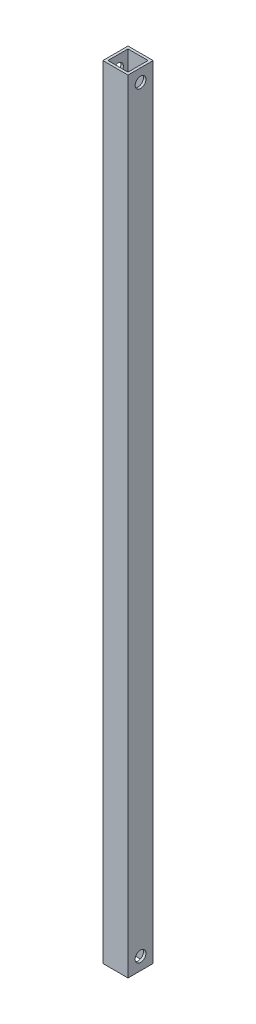
ISO-10303-21;
HEADER;
FILE_DESCRIPTION(('STEP AP214'),'2;1');
FILE_NAME('part.step','',(''),(''),'','','');
FILE_SCHEMA(('AUTOMOTIVE_DESIGN { 1 0 10303 214 1 1 1 1 }'));
ENDSEC;
DATA;
#1=APPLICATION_CONTEXT('core data for automotive mechanical design processes');
#2=APPLICATION_PROTOCOL_DEFINITION('international standard','automotive_design',2000,#1);
#3=PRODUCT_CONTEXT('',#1,'mechanical');
#4=PRODUCT('Part','Part','',(#3));
#5=PRODUCT_RELATED_PRODUCT_CATEGORY('part','',(#4));
#6=PRODUCT_DEFINITION_FORMATION('','',#4);
#7=PRODUCT_DEFINITION_CONTEXT('part definition',#1,'design');
#8=PRODUCT_DEFINITION('design','',#6,#7);
#9=PRODUCT_DEFINITION_SHAPE('','',#8);
#10=(LENGTH_UNIT() NAMED_UNIT(*) SI_UNIT(.MILLI.,.METRE.));
#11=(NAMED_UNIT(*) PLANE_ANGLE_UNIT() SI_UNIT($,.RADIAN.));
#12=(NAMED_UNIT(*) SI_UNIT($,.STERADIAN.) SOLID_ANGLE_UNIT());
#13=UNCERTAINTY_MEASURE_WITH_UNIT(LENGTH_MEASURE(1.E-05),#10,'distance_accuracy_value','');
#14=(GEOMETRIC_REPRESENTATION_CONTEXT(3) GLOBAL_UNCERTAINTY_ASSIGNED_CONTEXT((#13)) GLOBAL_UNIT_ASSIGNED_CONTEXT((#10,
#11,#12)) REPRESENTATION_CONTEXT('',''));
#15=CARTESIAN_POINT('',(0.,0.,0.));
#16=DIRECTION('',(0.,0.,1.));
#17=DIRECTION('',(1.,0.,0.));
#18=AXIS2_PLACEMENT_3D('',#15,#16,#17);
#19=CARTESIAN_POINT('',(0.,311.01868712756,0.));
#20=DIRECTION('',(0.,1.,0.));
#21=DIRECTION('',(0.,0.,1.));
#22=AXIS2_PLACEMENT_3D('',#19,#20,#21);
#23=PLANE('',#22);
#24=DIRECTION('',(0.,0.,-1.));
#25=VECTOR('',#24,1.);
#26=CARTESIAN_POINT('',(5.,311.01868712756,-5.));
#27=LINE('',#26,#25);
#28=CARTESIAN_POINT('',(5.,311.01868712756,5.));
#29=VERTEX_POINT('',#28);
#30=CARTESIAN_POINT('',(5.,311.01868712756,-5.));
#31=VERTEX_POINT('',#30);
#32=EDGE_CURVE('E164',#29,#31,#27,.T.);
#33=ORIENTED_EDGE('',*,*,#32,.T.);
#34=DIRECTION('',(-1.,0.,0.));
#35=VECTOR('',#34,1.);
#36=CARTESIAN_POINT('',(-5.,311.01868712756,-5.));
#37=LINE('',#36,#35);
#38=CARTESIAN_POINT('',(-5.,311.01868712756,-5.));
#39=VERTEX_POINT('',#38);
#40=EDGE_CURVE('E167',#31,#39,#37,.T.);
#41=ORIENTED_EDGE('',*,*,#40,.T.);
#42=DIRECTION('',(0.,0.,1.));
#43=VECTOR('',#42,1.);
#44=CARTESIAN_POINT('',(-5.,311.01868712756,-5.));
#45=LINE('',#44,#43);
#46=CARTESIAN_POINT('',(-5.,311.01868712756,5.));
#47=VERTEX_POINT('',#46);
#48=EDGE_CURVE('E170',#39,#47,#45,.T.);
#49=ORIENTED_EDGE('',*,*,#48,.T.);
#50=DIRECTION('',(1.,0.,0.));
#51=VECTOR('',#50,1.);
#52=CARTESIAN_POINT('',(-5.,311.01868712756,5.));
#53=LINE('',#52,#51);
#54=EDGE_CURVE('E172',#47,#29,#53,.T.);
#55=ORIENTED_EDGE('',*,*,#54,.T.);
#56=EDGE_LOOP('',(#33,#41,#49,#55));
#57=FACE_BOUND('',#56,.T.);
#58=DIRECTION('',(-1.,0.,0.));
#59=VECTOR('',#58,1.);
#60=CARTESIAN_POINT('',(-5.,311.01868712756,-4.));
#61=LINE('',#60,#59);
#62=CARTESIAN_POINT('',(4.,311.01868712756,-4.));
#63=VERTEX_POINT('',#62);
#64=CARTESIAN_POINT('',(-4.,311.01868712756,-4.));
#65=VERTEX_POINT('',#64);
#66=EDGE_CURVE('E134',#63,#65,#61,.T.);
#67=ORIENTED_EDGE('',*,*,#66,.F.);
#68=DIRECTION('',(0.,0.,-1.));
#69=VECTOR('',#68,1.);
#70=CARTESIAN_POINT('',(4.,311.01868712756,-5.));
#71=LINE('',#70,#69);
#72=CARTESIAN_POINT('',(4.,311.01868712756,4.));
#73=VERTEX_POINT('',#72);
#74=EDGE_CURVE('E126',#73,#63,#71,.T.);
#75=ORIENTED_EDGE('',*,*,#74,.F.);
#76=DIRECTION('',(1.,0.,0.));
#77=VECTOR('',#76,1.);
#78=CARTESIAN_POINT('',(-5.,311.01868712756,4.));
#79=LINE('',#78,#77);
#80=CARTESIAN_POINT('',(-4.,311.01868712756,4.));
#81=VERTEX_POINT('',#80);
#82=EDGE_CURVE('E148',#81,#73,#79,.T.);
#83=ORIENTED_EDGE('',*,*,#82,.F.);
#84=DIRECTION('',(0.,0.,1.));
#85=VECTOR('',#84,1.);
#86=CARTESIAN_POINT('',(-4.,311.01868712756,-5.));
#87=LINE('',#86,#85);
#88=EDGE_CURVE('E146',#65,#81,#87,.T.);
#89=ORIENTED_EDGE('',*,*,#88,.F.);
#90=EDGE_LOOP('',(#67,#75,#83,#89));
#91=FACE_BOUND('',#90,.T.);
#92=ADVANCED_FACE('F59',(#57,#91),#23,.T.);
#93=CARTESIAN_POINT('',(0.,0.,0.));
#94=DIRECTION('',(0.,1.,0.));
#95=DIRECTION('',(0.,0.,1.));
#96=AXIS2_PLACEMENT_3D('',#93,#94,#95);
#97=PLANE('',#96);
#98=DIRECTION('',(0.,0.,-1.));
#99=VECTOR('',#98,1.);
#100=CARTESIAN_POINT('',(5.,0.,-5.));
#101=LINE('',#100,#99);
#102=CARTESIAN_POINT('',(5.,0.,5.));
#103=VERTEX_POINT('',#102);
#104=CARTESIAN_POINT('',(5.,0.,-5.));
#105=VERTEX_POINT('',#104);
#106=EDGE_CURVE('E142',#103,#105,#101,.T.);
#107=ORIENTED_EDGE('',*,*,#106,.F.);
#108=DIRECTION('',(1.,0.,0.));
#109=VECTOR('',#108,1.);
#110=CARTESIAN_POINT('',(-5.,0.,5.));
#111=LINE('',#110,#109);
#112=CARTESIAN_POINT('',(-5.,0.,5.));
#113=VERTEX_POINT('',#112);
#114=EDGE_CURVE('E168',#113,#103,#111,.T.);
#115=ORIENTED_EDGE('',*,*,#114,.F.);
#116=DIRECTION('',(0.,0.,1.));
#117=VECTOR('',#116,1.);
#118=CARTESIAN_POINT('',(-5.,0.,-5.));
#119=LINE('',#118,#117);
#120=CARTESIAN_POINT('',(-5.,0.,-5.));
#121=VERTEX_POINT('',#120);
#122=EDGE_CURVE('E179',#121,#113,#119,.T.);
#123=ORIENTED_EDGE('',*,*,#122,.F.);
#124=DIRECTION('',(-1.,0.,0.));
#125=VECTOR('',#124,1.);
#126=CARTESIAN_POINT('',(-5.,0.,-5.));
#127=LINE('',#126,#125);
#128=EDGE_CURVE('E177',#105,#121,#127,.T.);
#129=ORIENTED_EDGE('',*,*,#128,.F.);
#130=EDGE_LOOP('',(#107,#115,#123,#129));
#131=FACE_BOUND('',#130,.T.);
#132=DIRECTION('',(0.,0.,-1.));
#133=VECTOR('',#132,1.);
#134=CARTESIAN_POINT('',(4.,0.,-5.));
#135=LINE('',#134,#133);
#136=CARTESIAN_POINT('',(4.,0.,4.));
#137=VERTEX_POINT('',#136);
#138=CARTESIAN_POINT('',(4.,0.,-4.));
#139=VERTEX_POINT('',#138);
#140=EDGE_CURVE('E84',#137,#139,#135,.T.);
#141=ORIENTED_EDGE('',*,*,#140,.T.);
#142=DIRECTION('',(-1.,0.,0.));
#143=VECTOR('',#142,1.);
#144=CARTESIAN_POINT('',(-5.,0.,-4.));
#145=LINE('',#144,#143);
#146=CARTESIAN_POINT('',(-4.,0.,-4.));
#147=VERTEX_POINT('',#146);
#148=EDGE_CURVE('E141',#139,#147,#145,.T.);
#149=ORIENTED_EDGE('',*,*,#148,.T.);
#150=DIRECTION('',(0.,0.,1.));
#151=VECTOR('',#150,1.);
#152=CARTESIAN_POINT('',(-4.,0.,-5.));
#153=LINE('',#152,#151);
#154=CARTESIAN_POINT('',(-4.,0.,4.));
#155=VERTEX_POINT('',#154);
#156=EDGE_CURVE('E156',#147,#155,#153,.T.);
#157=ORIENTED_EDGE('',*,*,#156,.T.);
#158=DIRECTION('',(1.,0.,0.));
#159=VECTOR('',#158,1.);
#160=CARTESIAN_POINT('',(-5.,0.,4.));
#161=LINE('',#160,#159);
#162=EDGE_CURVE('E135',#155,#137,#161,.T.);
#163=ORIENTED_EDGE('',*,*,#162,.T.);
#164=EDGE_LOOP('',(#141,#149,#157,#163));
#165=FACE_BOUND('',#164,.T.);
#166=ADVANCED_FACE('F226',(#131,#165),#97,.F.);
#167=CARTESIAN_POINT('',(5.,311.01868712756,-5.));
#168=DIRECTION('',(-1.,0.,0.));
#169=DIRECTION('',(0.,0.,1.));
#170=AXIS2_PLACEMENT_3D('',#167,#168,#169);
#171=PLANE('',#170);
#172=CARTESIAN_POINT('',(5.,5.,0.));
#173=DIRECTION('',(1.,0.,0.));
#174=DIRECTION('',(0.,0.,-1.));
#175=AXIS2_PLACEMENT_3D('',#172,#173,#174);
#176=CIRCLE('',#175,2.15);
#177=CARTESIAN_POINT('',(5.,5.,-2.15));
#178=VERTEX_POINT('',#177);
#179=EDGE_CURVE('E197',#178,#178,#176,.T.);
#180=ORIENTED_EDGE('',*,*,#179,.F.);
#181=EDGE_LOOP('',(#180));
#182=FACE_BOUND('',#181,.T.);
#183=CARTESIAN_POINT('',(5.,306.01868712756,0.));
#184=DIRECTION('',(1.,0.,0.));
#185=DIRECTION('',(0.,0.,1.));
#186=AXIS2_PLACEMENT_3D('',#183,#184,#185);
#187=CIRCLE('',#186,2.15);
#188=CARTESIAN_POINT('',(5.,306.01868712756,2.15));
#189=VERTEX_POINT('',#188);
#190=EDGE_CURVE('E207',#189,#189,#187,.T.);
#191=ORIENTED_EDGE('',*,*,#190,.F.);
#192=EDGE_LOOP('',(#191));
#193=FACE_BOUND('',#192,.T.);
#194=ORIENTED_EDGE('',*,*,#106,.T.);
#195=DIRECTION('',(0.,-1.,0.));
#196=VECTOR('',#195,1.);
#197=CARTESIAN_POINT('',(5.,311.01868712756,-5.));
#198=LINE('',#197,#196);
#199=EDGE_CURVE('E12',#31,#105,#198,.T.);
#200=ORIENTED_EDGE('',*,*,#199,.F.);
#201=ORIENTED_EDGE('',*,*,#32,.F.);
#202=DIRECTION('',(0.,-1.,0.));
#203=VECTOR('',#202,1.);
#204=CARTESIAN_POINT('',(5.,311.01868712756,5.));
#205=LINE('',#204,#203);
#206=EDGE_CURVE('E174',#29,#103,#205,.T.);
#207=ORIENTED_EDGE('',*,*,#206,.T.);
#208=EDGE_LOOP('',(#194,#200,#201,#207));
#209=FACE_BOUND('',#208,.T.);
#210=ADVANCED_FACE('F61',(#182,#193,#209),#171,.F.);
#211=CARTESIAN_POINT('',(-5.,311.01868712756,-5.));
#212=DIRECTION('',(0.,0.,1.));
#213=DIRECTION('',(1.,0.,0.));
#214=AXIS2_PLACEMENT_3D('',#211,#212,#213);
#215=PLANE('',#214);
#216=ORIENTED_EDGE('',*,*,#128,.T.);
#217=DIRECTION('',(0.,-1.,0.));
#218=VECTOR('',#217,1.);
#219=CARTESIAN_POINT('',(-5.,311.01868712756,-5.));
#220=LINE('',#219,#218);
#221=EDGE_CURVE('E68',#39,#121,#220,.T.);
#222=ORIENTED_EDGE('',*,*,#221,.F.);
#223=ORIENTED_EDGE('',*,*,#40,.F.);
#224=ORIENTED_EDGE('',*,*,#199,.T.);
#225=EDGE_LOOP('',(#216,#222,#223,#224));
#226=FACE_BOUND('',#225,.T.);
#227=ADVANCED_FACE('F252',(#226),#215,.F.);
#228=CARTESIAN_POINT('',(-5.,311.01868712756,-5.));
#229=DIRECTION('',(1.,0.,0.));
#230=DIRECTION('',(0.,0.,-1.));
#231=AXIS2_PLACEMENT_3D('',#228,#229,#230);
#232=PLANE('',#231);
#233=CARTESIAN_POINT('',(-5.,5.,0.));
#234=DIRECTION('',(1.,0.,0.));
#235=DIRECTION('',(0.,0.,-1.));
#236=AXIS2_PLACEMENT_3D('',#233,#234,#235);
#237=CIRCLE('',#236,2.15);
#238=CARTESIAN_POINT('',(-5.,5.,-2.15));
#239=VERTEX_POINT('',#238);
#240=EDGE_CURVE('E191',#239,#239,#237,.T.);
#241=ORIENTED_EDGE('',*,*,#240,.T.);
#242=EDGE_LOOP('',(#241));
#243=FACE_BOUND('',#242,.T.);
#244=CARTESIAN_POINT('',(-5.,306.01868712756,0.));
#245=DIRECTION('',(1.,0.,0.));
#246=DIRECTION('',(0.,0.,1.));
#247=AXIS2_PLACEMENT_3D('',#244,#245,#246);
#248=CIRCLE('',#247,2.15);
#249=CARTESIAN_POINT('',(-5.,306.01868712756,2.15));
#250=VERTEX_POINT('',#249);
#251=EDGE_CURVE('E202',#250,#250,#248,.T.);
#252=ORIENTED_EDGE('',*,*,#251,.T.);
#253=EDGE_LOOP('',(#252));
#254=FACE_BOUND('',#253,.T.);
#255=ORIENTED_EDGE('',*,*,#122,.T.);
#256=DIRECTION('',(0.,-1.,0.));
#257=VECTOR('',#256,1.);
#258=CARTESIAN_POINT('',(-5.,311.01868712756,5.));
#259=LINE('',#258,#257);
#260=EDGE_CURVE('E184',#47,#113,#259,.T.);
#261=ORIENTED_EDGE('',*,*,#260,.F.);
#262=ORIENTED_EDGE('',*,*,#48,.F.);
#263=ORIENTED_EDGE('',*,*,#221,.T.);
#264=EDGE_LOOP('',(#255,#261,#262,#263));
#265=FACE_BOUND('',#264,.T.);
#266=ADVANCED_FACE('F249',(#243,#254,#265),#232,.F.);
#267=CARTESIAN_POINT('',(-5.,311.01868712756,5.));
#268=DIRECTION('',(0.,0.,-1.));
#269=DIRECTION('',(-1.,0.,0.));
#270=AXIS2_PLACEMENT_3D('',#267,#268,#269);
#271=PLANE('',#270);
#272=ORIENTED_EDGE('',*,*,#114,.T.);
#273=ORIENTED_EDGE('',*,*,#206,.F.);
#274=ORIENTED_EDGE('',*,*,#54,.F.);
#275=ORIENTED_EDGE('',*,*,#260,.T.);
#276=EDGE_LOOP('',(#272,#273,#274,#275));
#277=FACE_BOUND('',#276,.T.);
#278=ADVANCED_FACE('F246',(#277),#271,.F.);
#279=CARTESIAN_POINT('',(4.,311.01868712756,-5.));
#280=DIRECTION('',(-1.,0.,0.));
#281=DIRECTION('',(0.,0.,1.));
#282=AXIS2_PLACEMENT_3D('',#279,#280,#281);
#283=PLANE('',#282);
#284=CARTESIAN_POINT('',(4.,5.,0.));
#285=DIRECTION('',(-1.,0.,0.));
#286=DIRECTION('',(0.,0.,1.));
#287=AXIS2_PLACEMENT_3D('',#284,#285,#286);
#288=CIRCLE('',#287,2.15);
#289=CARTESIAN_POINT('',(4.,5.,2.15));
#290=VERTEX_POINT('',#289);
#291=EDGE_CURVE('E154',#290,#290,#288,.T.);
#292=ORIENTED_EDGE('',*,*,#291,.F.);
#293=EDGE_LOOP('',(#292));
#294=FACE_BOUND('',#293,.T.);
#295=CARTESIAN_POINT('',(4.,306.01868712756,0.));
#296=DIRECTION('',(-1.,0.,0.));
#297=DIRECTION('',(0.,0.,1.));
#298=AXIS2_PLACEMENT_3D('',#295,#296,#297);
#299=CIRCLE('',#298,2.15);
#300=CARTESIAN_POINT('',(4.,306.01868712756,2.15));
#301=VERTEX_POINT('',#300);
#302=EDGE_CURVE('E190',#301,#301,#299,.T.);
#303=ORIENTED_EDGE('',*,*,#302,.F.);
#304=EDGE_LOOP('',(#303));
#305=FACE_BOUND('',#304,.T.);
#306=ORIENTED_EDGE('',*,*,#140,.F.);
#307=DIRECTION('',(0.,-1.,0.));
#308=VECTOR('',#307,1.);
#309=CARTESIAN_POINT('',(4.,311.01868712756,4.));
#310=LINE('',#309,#308);
#311=EDGE_CURVE('E130',#73,#137,#310,.T.);
#312=ORIENTED_EDGE('',*,*,#311,.F.);
#313=ORIENTED_EDGE('',*,*,#74,.T.);
#314=DIRECTION('',(0.,-1.,0.));
#315=VECTOR('',#314,1.);
#316=CARTESIAN_POINT('',(4.,311.01868712756,-4.));
#317=LINE('',#316,#315);
#318=EDGE_CURVE('E129',#63,#139,#317,.T.);
#319=ORIENTED_EDGE('',*,*,#318,.T.);
#320=EDGE_LOOP('',(#306,#312,#313,#319));
#321=FACE_BOUND('',#320,.T.);
#322=ADVANCED_FACE('F128',(#294,#305,#321),#283,.T.);
#323=CARTESIAN_POINT('',(-5.,311.01868712756,-4.));
#324=DIRECTION('',(0.,0.,1.));
#325=DIRECTION('',(1.,0.,0.));
#326=AXIS2_PLACEMENT_3D('',#323,#324,#325);
#327=PLANE('',#326);
#328=ORIENTED_EDGE('',*,*,#148,.F.);
#329=ORIENTED_EDGE('',*,*,#318,.F.);
#330=ORIENTED_EDGE('',*,*,#66,.T.);
#331=DIRECTION('',(0.,-1.,0.));
#332=VECTOR('',#331,1.);
#333=CARTESIAN_POINT('',(-4.,311.01868712756,-4.));
#334=LINE('',#333,#332);
#335=EDGE_CURVE('E143',#65,#147,#334,.T.);
#336=ORIENTED_EDGE('',*,*,#335,.T.);
#337=EDGE_LOOP('',(#328,#329,#330,#336));
#338=FACE_BOUND('',#337,.T.);
#339=ADVANCED_FACE('F138',(#338),#327,.T.);
#340=CARTESIAN_POINT('',(-4.,311.01868712756,-5.));
#341=DIRECTION('',(1.,0.,0.));
#342=DIRECTION('',(0.,0.,-1.));
#343=AXIS2_PLACEMENT_3D('',#340,#341,#342);
#344=PLANE('',#343);
#345=CARTESIAN_POINT('',(-4.,5.,0.));
#346=DIRECTION('',(1.,0.,0.));
#347=DIRECTION('',(0.,0.,-1.));
#348=AXIS2_PLACEMENT_3D('',#345,#346,#347);
#349=CIRCLE('',#348,2.15);
#350=CARTESIAN_POINT('',(-4.,5.,-2.15));
#351=VERTEX_POINT('',#350);
#352=EDGE_CURVE('E63',#351,#351,#349,.T.);
#353=ORIENTED_EDGE('',*,*,#352,.F.);
#354=EDGE_LOOP('',(#353));
#355=FACE_BOUND('',#354,.T.);
#356=CARTESIAN_POINT('',(-4.,306.01868712756,0.));
#357=DIRECTION('',(1.,0.,0.));
#358=DIRECTION('',(0.,0.,-1.));
#359=AXIS2_PLACEMENT_3D('',#356,#357,#358);
#360=CIRCLE('',#359,2.15);
#361=CARTESIAN_POINT('',(-4.,306.01868712756,-2.15));
#362=VERTEX_POINT('',#361);
#363=EDGE_CURVE('E188',#362,#362,#360,.T.);
#364=ORIENTED_EDGE('',*,*,#363,.F.);
#365=EDGE_LOOP('',(#364));
#366=FACE_BOUND('',#365,.T.);
#367=ORIENTED_EDGE('',*,*,#156,.F.);
#368=ORIENTED_EDGE('',*,*,#335,.F.);
#369=ORIENTED_EDGE('',*,*,#88,.T.);
#370=DIRECTION('',(0.,-1.,0.));
#371=VECTOR('',#370,1.);
#372=CARTESIAN_POINT('',(-4.,311.01868712756,4.));
#373=LINE('',#372,#371);
#374=EDGE_CURVE('E76',#81,#155,#373,.T.);
#375=ORIENTED_EDGE('',*,*,#374,.T.);
#376=EDGE_LOOP('',(#367,#368,#369,#375));
#377=FACE_BOUND('',#376,.T.);
#378=ADVANCED_FACE('F218',(#355,#366,#377),#344,.T.);
#379=CARTESIAN_POINT('',(-5.,311.01868712756,4.));
#380=DIRECTION('',(0.,0.,-1.));
#381=DIRECTION('',(-1.,0.,0.));
#382=AXIS2_PLACEMENT_3D('',#379,#380,#381);
#383=PLANE('',#382);
#384=ORIENTED_EDGE('',*,*,#162,.F.);
#385=ORIENTED_EDGE('',*,*,#374,.F.);
#386=ORIENTED_EDGE('',*,*,#82,.T.);
#387=ORIENTED_EDGE('',*,*,#311,.T.);
#388=EDGE_LOOP('',(#384,#385,#386,#387));
#389=FACE_BOUND('',#388,.T.);
#390=ADVANCED_FACE('F221',(#389),#383,.T.);
#391=CARTESIAN_POINT('',(-5.,306.01868712756,0.));
#392=DIRECTION('',(1.,0.,0.));
#393=DIRECTION('',(0.,0.,-1.));
#394=AXIS2_PLACEMENT_3D('',#391,#392,#393);
#395=CYLINDRICAL_SURFACE('',#394,2.15);
#396=ORIENTED_EDGE('',*,*,#363,.T.);
#397=EDGE_LOOP('',(#396));
#398=FACE_BOUND('',#397,.T.);
#399=ORIENTED_EDGE('',*,*,#251,.F.);
#400=EDGE_LOOP('',(#399));
#401=FACE_BOUND('',#400,.T.);
#402=ADVANCED_FACE('F228',(#398,#401),#395,.F.);
#403=CARTESIAN_POINT('',(-5.,5.,0.));
#404=DIRECTION('',(1.,0.,0.));
#405=DIRECTION('',(0.,0.,-1.));
#406=AXIS2_PLACEMENT_3D('',#403,#404,#405);
#407=CYLINDRICAL_SURFACE('',#406,2.15);
#408=ORIENTED_EDGE('',*,*,#352,.T.);
#409=EDGE_LOOP('',(#408));
#410=FACE_BOUND('',#409,.T.);
#411=ORIENTED_EDGE('',*,*,#240,.F.);
#412=EDGE_LOOP('',(#411));
#413=FACE_BOUND('',#412,.T.);
#414=ADVANCED_FACE('F215',(#410,#413),#407,.F.);
#415=ORIENTED_EDGE('',*,*,#302,.T.);
#416=EDGE_LOOP('',(#415));
#417=FACE_BOUND('',#416,.T.);
#418=ORIENTED_EDGE('',*,*,#190,.T.);
#419=EDGE_LOOP('',(#418));
#420=FACE_BOUND('',#419,.T.);
#421=ADVANCED_FACE('F234',(#417,#420),#395,.F.);
#422=ORIENTED_EDGE('',*,*,#291,.T.);
#423=EDGE_LOOP('',(#422));
#424=FACE_BOUND('',#423,.T.);
#425=ORIENTED_EDGE('',*,*,#179,.T.);
#426=EDGE_LOOP('',(#425));
#427=FACE_BOUND('',#426,.T.);
#428=ADVANCED_FACE('F278',(#424,#427),#407,.F.);
#429=CLOSED_SHELL('',(#92,#166,#210,#227,#266,#278,#322,#339,#378,#390,#402,#414,#421,#428));
#430=MANIFOLD_SOLID_BREP('B2',#429);
#431=ADVANCED_BREP_SHAPE_REPRESENTATION('',(#18,#430),#14);
#432=SHAPE_DEFINITION_REPRESENTATION(#9,#431);
ENDSEC;
END-ISO-10303-21;
